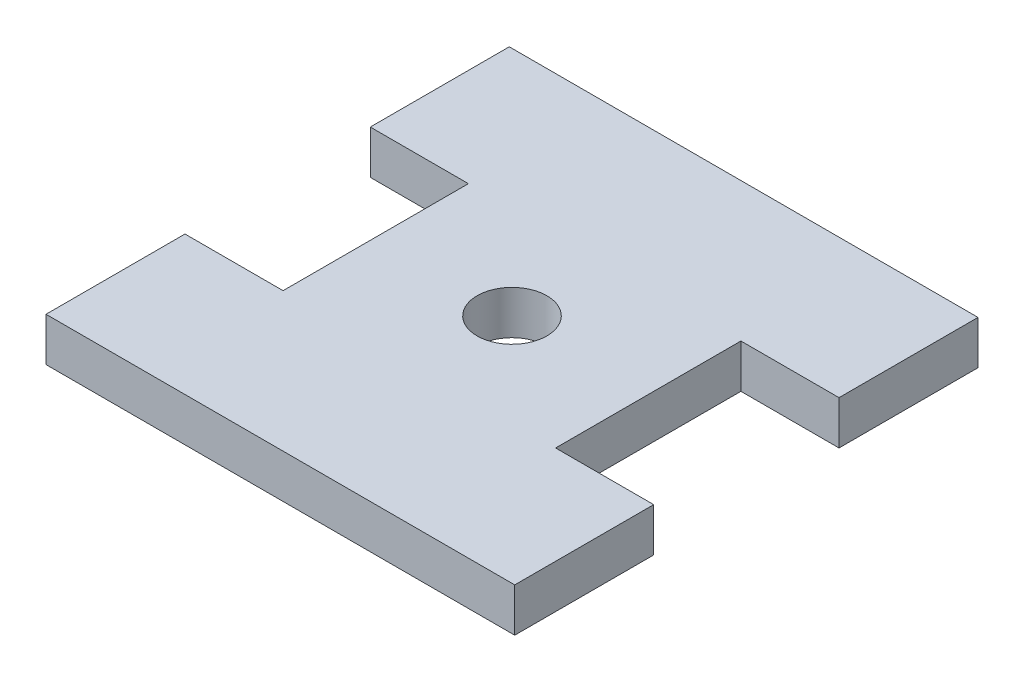
ISO-10303-21;
HEADER;
FILE_DESCRIPTION(('STEP AP214'),'2;1');
FILE_NAME('part.step','',(''),(''),'','','');
FILE_SCHEMA(('AUTOMOTIVE_DESIGN { 1 0 10303 214 1 1 1 1 }'));
ENDSEC;
DATA;
#1=APPLICATION_CONTEXT('core data for automotive mechanical design processes');
#2=APPLICATION_PROTOCOL_DEFINITION('international standard','automotive_design',2000,#1);
#3=PRODUCT_CONTEXT('',#1,'mechanical');
#4=PRODUCT('Part','Part','',(#3));
#5=PRODUCT_RELATED_PRODUCT_CATEGORY('part','',(#4));
#6=PRODUCT_DEFINITION_FORMATION('','',#4);
#7=PRODUCT_DEFINITION_CONTEXT('part definition',#1,'design');
#8=PRODUCT_DEFINITION('design','',#6,#7);
#9=PRODUCT_DEFINITION_SHAPE('','',#8);
#10=(LENGTH_UNIT() NAMED_UNIT(*) SI_UNIT(.MILLI.,.METRE.));
#11=(NAMED_UNIT(*) PLANE_ANGLE_UNIT() SI_UNIT($,.RADIAN.));
#12=(NAMED_UNIT(*) SI_UNIT($,.STERADIAN.) SOLID_ANGLE_UNIT());
#13=UNCERTAINTY_MEASURE_WITH_UNIT(LENGTH_MEASURE(1.E-05),#10,'distance_accuracy_value','');
#14=(GEOMETRIC_REPRESENTATION_CONTEXT(3) GLOBAL_UNCERTAINTY_ASSIGNED_CONTEXT((#13)) GLOBAL_UNIT_ASSIGNED_CONTEXT((#10,
#11,#12)) REPRESENTATION_CONTEXT('',''));
#15=CARTESIAN_POINT('',(0.,0.,0.));
#16=DIRECTION('',(0.,0.,1.));
#17=DIRECTION('',(1.,0.,0.));
#18=AXIS2_PLACEMENT_3D('',#15,#16,#17);
#19=CARTESIAN_POINT('',(58.3260528824176,4.,20.6399232100999));
#20=DIRECTION('',(-1.,0.,0.));
#21=DIRECTION('',(0.,0.,1.));
#22=AXIS2_PLACEMENT_3D('',#19,#20,#21);
#23=PLANE('',#22);
#24=DIRECTION('',(0.,0.,-1.));
#25=VECTOR('',#24,1.);
#26=CARTESIAN_POINT('',(58.3260528824176,0.,20.6399232100999));
#27=LINE('',#26,#25);
#28=CARTESIAN_POINT('',(58.3260528824176,0.,63.1399232100999));
#29=VERTEX_POINT('',#28);
#30=CARTESIAN_POINT('',(58.3260528824176,0.,50.3899232100999));
#31=VERTEX_POINT('',#30);
#32=EDGE_CURVE('E205',#29,#31,#27,.T.);
#33=ORIENTED_EDGE('',*,*,#32,.T.);
#34=DIRECTION('',(0.,1.,0.));
#35=VECTOR('',#34,1.);
#36=CARTESIAN_POINT('',(58.3260528824176,0.,50.3899232100999));
#37=LINE('',#36,#35);
#38=CARTESIAN_POINT('',(58.3260528824176,4.,50.3899232100999));
#39=VERTEX_POINT('',#38);
#40=EDGE_CURVE('E151',#31,#39,#37,.T.);
#41=ORIENTED_EDGE('',*,*,#40,.T.);
#42=DIRECTION('',(0.,0.,-1.));
#43=VECTOR('',#42,1.);
#44=CARTESIAN_POINT('',(58.3260528824176,4.,20.6399232100999));
#45=LINE('',#44,#43);
#46=CARTESIAN_POINT('',(58.3260528824176,4.,63.1399232100999));
#47=VERTEX_POINT('',#46);
#48=EDGE_CURVE('E194',#47,#39,#45,.T.);
#49=ORIENTED_EDGE('',*,*,#48,.F.);
#50=DIRECTION('',(0.,-1.,0.));
#51=VECTOR('',#50,1.);
#52=CARTESIAN_POINT('',(58.3260528824176,4.,63.1399232100999));
#53=LINE('',#52,#51);
#54=EDGE_CURVE('E40',#47,#29,#53,.T.);
#55=ORIENTED_EDGE('',*,*,#54,.T.);
#56=EDGE_LOOP('',(#33,#41,#49,#55));
#57=FACE_BOUND('',#56,.T.);
#58=ADVANCED_FACE('F32',(#57),#23,.F.);
#59=CARTESIAN_POINT('',(15.3260528824176,4.,20.6399232100999));
#60=DIRECTION('',(1.,0.,0.));
#61=DIRECTION('',(0.,0.,-1.));
#62=AXIS2_PLACEMENT_3D('',#59,#60,#61);
#63=PLANE('',#62);
#64=DIRECTION('',(0.,0.,1.));
#65=VECTOR('',#64,1.);
#66=CARTESIAN_POINT('',(15.3260528824176,0.,20.6399232100999));
#67=LINE('',#66,#65);
#68=CARTESIAN_POINT('',(15.3260528824176,0.,20.6399232100999));
#69=VERTEX_POINT('',#68);
#70=CARTESIAN_POINT('',(15.3260528824176,0.,33.3899232100999));
#71=VERTEX_POINT('',#70);
#72=EDGE_CURVE('E200',#69,#71,#67,.T.);
#73=ORIENTED_EDGE('',*,*,#72,.T.);
#74=DIRECTION('',(0.,1.,0.));
#75=VECTOR('',#74,1.);
#76=CARTESIAN_POINT('',(15.3260528824176,0.,33.3899232100999));
#77=LINE('',#76,#75);
#78=CARTESIAN_POINT('',(15.3260528824176,4.,33.3899232100999));
#79=VERTEX_POINT('',#78);
#80=EDGE_CURVE('E172',#71,#79,#77,.T.);
#81=ORIENTED_EDGE('',*,*,#80,.T.);
#82=DIRECTION('',(0.,0.,1.));
#83=VECTOR('',#82,1.);
#84=CARTESIAN_POINT('',(15.3260528824176,4.,20.6399232100999));
#85=LINE('',#84,#83);
#86=CARTESIAN_POINT('',(15.3260528824176,4.,20.6399232100999));
#87=VERTEX_POINT('',#86);
#88=EDGE_CURVE('E187',#87,#79,#85,.T.);
#89=ORIENTED_EDGE('',*,*,#88,.F.);
#90=DIRECTION('',(0.,-1.,0.));
#91=VECTOR('',#90,1.);
#92=CARTESIAN_POINT('',(15.3260528824176,4.,20.6399232100999));
#93=LINE('',#92,#91);
#94=EDGE_CURVE('E199',#87,#69,#93,.T.);
#95=ORIENTED_EDGE('',*,*,#94,.T.);
#96=EDGE_LOOP('',(#73,#81,#89,#95));
#97=FACE_BOUND('',#96,.T.);
#98=ADVANCED_FACE('F245',(#97),#63,.F.);
#99=CARTESIAN_POINT('',(15.3260528824176,4.,63.1399232100999));
#100=DIRECTION('',(0.,1.,0.));
#101=DIRECTION('',(0.,0.,1.));
#102=AXIS2_PLACEMENT_3D('',#99,#100,#101);
#103=PLANE('',#102);
#104=DIRECTION('',(1.,0.,0.));
#105=VECTOR('',#104,1.);
#106=CARTESIAN_POINT('',(58.3260528824176,4.,50.3899232100999));
#107=LINE('',#106,#105);
#108=CARTESIAN_POINT('',(49.3260528824176,4.,50.3899232100999));
#109=VERTEX_POINT('',#108);
#110=EDGE_CURVE('E143',#109,#39,#107,.T.);
#111=ORIENTED_EDGE('',*,*,#110,.F.);
#112=DIRECTION('',(0.,0.,1.));
#113=VECTOR('',#112,1.);
#114=CARTESIAN_POINT('',(49.3260528824176,4.,33.3899232100999));
#115=LINE('',#114,#113);
#116=CARTESIAN_POINT('',(49.3260528824176,4.,33.3899232100999));
#117=VERTEX_POINT('',#116);
#118=EDGE_CURVE('E145',#117,#109,#115,.T.);
#119=ORIENTED_EDGE('',*,*,#118,.F.);
#120=DIRECTION('',(-1.,0.,0.));
#121=VECTOR('',#120,1.);
#122=CARTESIAN_POINT('',(58.3260528824176,4.,33.3899232100999));
#123=LINE('',#122,#121);
#124=CARTESIAN_POINT('',(58.3260528824176,4.,33.3899232100999));
#125=VERTEX_POINT('',#124);
#126=EDGE_CURVE('E123',#125,#117,#123,.T.);
#127=ORIENTED_EDGE('',*,*,#126,.F.);
#128=CARTESIAN_POINT('',(58.3260528824176,4.,20.6399232100999));
#129=VERTEX_POINT('',#128);
#130=EDGE_CURVE('E193',#125,#129,#45,.T.);
#131=ORIENTED_EDGE('',*,*,#130,.T.);
#132=DIRECTION('',(-1.,0.,0.));
#133=VECTOR('',#132,1.);
#134=CARTESIAN_POINT('',(15.3260528824176,4.,20.6399232100999));
#135=LINE('',#134,#133);
#136=EDGE_CURVE('E197',#129,#87,#135,.T.);
#137=ORIENTED_EDGE('',*,*,#136,.T.);
#138=ORIENTED_EDGE('',*,*,#88,.T.);
#139=DIRECTION('',(-1.,0.,0.));
#140=VECTOR('',#139,1.);
#141=CARTESIAN_POINT('',(15.3260528824176,4.,33.3899232100999));
#142=LINE('',#141,#140);
#143=CARTESIAN_POINT('',(24.3260528824176,4.,33.3899232100999));
#144=VERTEX_POINT('',#143);
#145=EDGE_CURVE('E159',#144,#79,#142,.T.);
#146=ORIENTED_EDGE('',*,*,#145,.F.);
#147=DIRECTION('',(0.,0.,-1.));
#148=VECTOR('',#147,1.);
#149=CARTESIAN_POINT('',(24.3260528824176,4.,33.3899232100999));
#150=LINE('',#149,#148);
#151=CARTESIAN_POINT('',(24.3260528824176,4.,50.3899232100999));
#152=VERTEX_POINT('',#151);
#153=EDGE_CURVE('E168',#152,#144,#150,.T.);
#154=ORIENTED_EDGE('',*,*,#153,.F.);
#155=DIRECTION('',(1.,0.,0.));
#156=VECTOR('',#155,1.);
#157=CARTESIAN_POINT('',(15.3260528824176,4.,50.3899232100999));
#158=LINE('',#157,#156);
#159=CARTESIAN_POINT('',(15.3260528824176,4.,50.3899232100999));
#160=VERTEX_POINT('',#159);
#161=EDGE_CURVE('E154',#160,#152,#158,.T.);
#162=ORIENTED_EDGE('',*,*,#161,.F.);
#163=CARTESIAN_POINT('',(15.3260528824176,4.,63.1399232100999));
#164=VERTEX_POINT('',#163);
#165=EDGE_CURVE('E191',#160,#164,#85,.T.);
#166=ORIENTED_EDGE('',*,*,#165,.T.);
#167=DIRECTION('',(1.,0.,0.));
#168=VECTOR('',#167,1.);
#169=CARTESIAN_POINT('',(15.3260528824176,4.,63.1399232100999));
#170=LINE('',#169,#168);
#171=EDGE_CURVE('E190',#164,#47,#170,.T.);
#172=ORIENTED_EDGE('',*,*,#171,.T.);
#173=ORIENTED_EDGE('',*,*,#48,.T.);
#174=EDGE_LOOP('',(#111,#119,#127,#131,#137,#138,#146,#154,#162,#166,#172,#173));
#175=FACE_BOUND('',#174,.T.);
#176=CARTESIAN_POINT('',(36.8260528824176,4.,41.8899232100999));
#177=DIRECTION('',(0.,1.,0.));
#178=DIRECTION('',(0.,0.,1.));
#179=AXIS2_PLACEMENT_3D('',#176,#177,#178);
#180=CIRCLE('',#179,3.2);
#181=CARTESIAN_POINT('',(36.8260528824176,4.,45.0899232100999));
#182=VERTEX_POINT('',#181);
#183=EDGE_CURVE('E181',#182,#182,#180,.T.);
#184=ORIENTED_EDGE('',*,*,#183,.F.);
#185=EDGE_LOOP('',(#184));
#186=FACE_BOUND('',#185,.T.);
#187=ADVANCED_FACE('F227',(#175,#186),#103,.T.);
#188=CARTESIAN_POINT('',(15.3260528824176,0.,63.1399232100999));
#189=DIRECTION('',(0.,1.,0.));
#190=DIRECTION('',(0.,0.,1.));
#191=AXIS2_PLACEMENT_3D('',#188,#189,#190);
#192=PLANE('',#191);
#193=DIRECTION('',(0.,0.,1.));
#194=VECTOR('',#193,1.);
#195=CARTESIAN_POINT('',(49.3260528824176,0.,33.3899232100999));
#196=LINE('',#195,#194);
#197=CARTESIAN_POINT('',(49.3260528824176,0.,33.3899232100999));
#198=VERTEX_POINT('',#197);
#199=CARTESIAN_POINT('',(49.3260528824176,0.,50.3899232100999));
#200=VERTEX_POINT('',#199);
#201=EDGE_CURVE('E131',#198,#200,#196,.T.);
#202=ORIENTED_EDGE('',*,*,#201,.T.);
#203=DIRECTION('',(1.,0.,0.));
#204=VECTOR('',#203,1.);
#205=CARTESIAN_POINT('',(58.3260528824176,0.,50.3899232100999));
#206=LINE('',#205,#204);
#207=EDGE_CURVE('E136',#200,#31,#206,.T.);
#208=ORIENTED_EDGE('',*,*,#207,.T.);
#209=ORIENTED_EDGE('',*,*,#32,.F.);
#210=DIRECTION('',(1.,0.,0.));
#211=VECTOR('',#210,1.);
#212=CARTESIAN_POINT('',(15.3260528824176,0.,63.1399232100999));
#213=LINE('',#212,#211);
#214=CARTESIAN_POINT('',(15.3260528824176,0.,63.1399232100999));
#215=VERTEX_POINT('',#214);
#216=EDGE_CURVE('E203',#215,#29,#213,.T.);
#217=ORIENTED_EDGE('',*,*,#216,.F.);
#218=CARTESIAN_POINT('',(15.3260528824176,0.,50.3899232100999));
#219=VERTEX_POINT('',#218);
#220=EDGE_CURVE('E184',#219,#215,#67,.T.);
#221=ORIENTED_EDGE('',*,*,#220,.F.);
#222=DIRECTION('',(1.,0.,0.));
#223=VECTOR('',#222,1.);
#224=CARTESIAN_POINT('',(15.3260528824176,0.,50.3899232100999));
#225=LINE('',#224,#223);
#226=CARTESIAN_POINT('',(24.3260528824176,0.,50.3899232100999));
#227=VERTEX_POINT('',#226);
#228=EDGE_CURVE('E55',#219,#227,#225,.T.);
#229=ORIENTED_EDGE('',*,*,#228,.T.);
#230=DIRECTION('',(0.,0.,-1.));
#231=VECTOR('',#230,1.);
#232=CARTESIAN_POINT('',(24.3260528824176,0.,33.3899232100999));
#233=LINE('',#232,#231);
#234=CARTESIAN_POINT('',(24.3260528824176,0.,33.3899232100999));
#235=VERTEX_POINT('',#234);
#236=EDGE_CURVE('E158',#227,#235,#233,.T.);
#237=ORIENTED_EDGE('',*,*,#236,.T.);
#238=DIRECTION('',(-1.,0.,0.));
#239=VECTOR('',#238,1.);
#240=CARTESIAN_POINT('',(15.3260528824176,0.,33.3899232100999));
#241=LINE('',#240,#239);
#242=EDGE_CURVE('E162',#235,#71,#241,.T.);
#243=ORIENTED_EDGE('',*,*,#242,.T.);
#244=ORIENTED_EDGE('',*,*,#72,.F.);
#245=DIRECTION('',(-1.,0.,0.));
#246=VECTOR('',#245,1.);
#247=CARTESIAN_POINT('',(15.3260528824176,0.,20.6399232100999));
#248=LINE('',#247,#246);
#249=CARTESIAN_POINT('',(58.3260528824176,0.,20.6399232100999));
#250=VERTEX_POINT('',#249);
#251=EDGE_CURVE('E208',#250,#69,#248,.T.);
#252=ORIENTED_EDGE('',*,*,#251,.F.);
#253=CARTESIAN_POINT('',(58.3260528824176,0.,33.3899232100999));
#254=VERTEX_POINT('',#253);
#255=EDGE_CURVE('E142',#254,#250,#27,.T.);
#256=ORIENTED_EDGE('',*,*,#255,.F.);
#257=DIRECTION('',(-1.,0.,0.));
#258=VECTOR('',#257,1.);
#259=CARTESIAN_POINT('',(58.3260528824176,0.,33.3899232100999));
#260=LINE('',#259,#258);
#261=EDGE_CURVE('E47',#254,#198,#260,.T.);
#262=ORIENTED_EDGE('',*,*,#261,.T.);
#263=EDGE_LOOP('',(#202,#208,#209,#217,#221,#229,#237,#243,#244,#252,#256,#262));
#264=FACE_BOUND('',#263,.T.);
#265=CARTESIAN_POINT('',(36.8260528824176,0.,41.8899232100999));
#266=DIRECTION('',(0.,1.,0.));
#267=DIRECTION('',(0.,0.,1.));
#268=AXIS2_PLACEMENT_3D('',#265,#266,#267);
#269=CIRCLE('',#268,3.2);
#270=CARTESIAN_POINT('',(36.8260528824176,0.,45.0899232100999));
#271=VERTEX_POINT('',#270);
#272=EDGE_CURVE('E175',#271,#271,#269,.T.);
#273=ORIENTED_EDGE('',*,*,#272,.T.);
#274=EDGE_LOOP('',(#273));
#275=FACE_BOUND('',#274,.T.);
#276=ADVANCED_FACE('F139',(#264,#275),#192,.F.);
#277=ORIENTED_EDGE('',*,*,#165,.F.);
#278=DIRECTION('',(0.,1.,0.));
#279=VECTOR('',#278,1.);
#280=CARTESIAN_POINT('',(15.3260528824176,0.,50.3899232100999));
#281=LINE('',#280,#279);
#282=EDGE_CURVE('E165',#219,#160,#281,.T.);
#283=ORIENTED_EDGE('',*,*,#282,.F.);
#284=ORIENTED_EDGE('',*,*,#220,.T.);
#285=DIRECTION('',(0.,-1.,0.));
#286=VECTOR('',#285,1.);
#287=CARTESIAN_POINT('',(15.3260528824176,4.,63.1399232100999));
#288=LINE('',#287,#286);
#289=EDGE_CURVE('E11',#164,#215,#288,.T.);
#290=ORIENTED_EDGE('',*,*,#289,.F.);
#291=EDGE_LOOP('',(#277,#283,#284,#290));
#292=FACE_BOUND('',#291,.T.);
#293=ADVANCED_FACE('F34',(#292),#63,.F.);
#294=CARTESIAN_POINT('',(15.3260528824176,4.,63.1399232100999));
#295=DIRECTION('',(0.,0.,-1.));
#296=DIRECTION('',(-1.,0.,0.));
#297=AXIS2_PLACEMENT_3D('',#294,#295,#296);
#298=PLANE('',#297);
#299=ORIENTED_EDGE('',*,*,#216,.T.);
#300=ORIENTED_EDGE('',*,*,#54,.F.);
#301=ORIENTED_EDGE('',*,*,#171,.F.);
#302=ORIENTED_EDGE('',*,*,#289,.T.);
#303=EDGE_LOOP('',(#299,#300,#301,#302));
#304=FACE_BOUND('',#303,.T.);
#305=ADVANCED_FACE('F232',(#304),#298,.F.);
#306=ORIENTED_EDGE('',*,*,#130,.F.);
#307=DIRECTION('',(0.,1.,0.));
#308=VECTOR('',#307,1.);
#309=CARTESIAN_POINT('',(58.3260528824176,0.,33.3899232100999));
#310=LINE('',#309,#308);
#311=EDGE_CURVE('E128',#254,#125,#310,.T.);
#312=ORIENTED_EDGE('',*,*,#311,.F.);
#313=ORIENTED_EDGE('',*,*,#255,.T.);
#314=DIRECTION('',(0.,-1.,0.));
#315=VECTOR('',#314,1.);
#316=CARTESIAN_POINT('',(58.3260528824176,4.,20.6399232100999));
#317=LINE('',#316,#315);
#318=EDGE_CURVE('E212',#129,#250,#317,.T.);
#319=ORIENTED_EDGE('',*,*,#318,.F.);
#320=EDGE_LOOP('',(#306,#312,#313,#319));
#321=FACE_BOUND('',#320,.T.);
#322=ADVANCED_FACE('F253',(#321),#23,.F.);
#323=CARTESIAN_POINT('',(15.3260528824176,4.,20.6399232100999));
#324=DIRECTION('',(0.,0.,1.));
#325=DIRECTION('',(1.,0.,0.));
#326=AXIS2_PLACEMENT_3D('',#323,#324,#325);
#327=PLANE('',#326);
#328=ORIENTED_EDGE('',*,*,#251,.T.);
#329=ORIENTED_EDGE('',*,*,#94,.F.);
#330=ORIENTED_EDGE('',*,*,#136,.F.);
#331=ORIENTED_EDGE('',*,*,#318,.T.);
#332=EDGE_LOOP('',(#328,#329,#330,#331));
#333=FACE_BOUND('',#332,.T.);
#334=ADVANCED_FACE('F251',(#333),#327,.F.);
#335=CARTESIAN_POINT('',(36.8260528824176,4.,41.8899232100999));
#336=DIRECTION('',(0.,-1.,0.));
#337=DIRECTION('',(0.,0.,-1.));
#338=AXIS2_PLACEMENT_3D('',#335,#336,#337);
#339=CYLINDRICAL_SURFACE('',#338,3.2);
#340=ORIENTED_EDGE('',*,*,#183,.T.);
#341=EDGE_LOOP('',(#340));
#342=FACE_BOUND('',#341,.T.);
#343=ORIENTED_EDGE('',*,*,#272,.F.);
#344=EDGE_LOOP('',(#343));
#345=FACE_BOUND('',#344,.T.);
#346=ADVANCED_FACE('F260',(#342,#345),#339,.F.);
#347=CARTESIAN_POINT('',(15.3260528824176,0.,33.3899232100999));
#348=DIRECTION('',(0.,0.,-1.));
#349=DIRECTION('',(-1.,0.,0.));
#350=AXIS2_PLACEMENT_3D('',#347,#348,#349);
#351=PLANE('',#350);
#352=ORIENTED_EDGE('',*,*,#145,.T.);
#353=ORIENTED_EDGE('',*,*,#80,.F.);
#354=ORIENTED_EDGE('',*,*,#242,.F.);
#355=DIRECTION('',(0.,1.,0.));
#356=VECTOR('',#355,1.);
#357=CARTESIAN_POINT('',(24.3260528824176,0.,33.3899232100999));
#358=LINE('',#357,#356);
#359=EDGE_CURVE('E176',#235,#144,#358,.T.);
#360=ORIENTED_EDGE('',*,*,#359,.T.);
#361=EDGE_LOOP('',(#352,#353,#354,#360));
#362=FACE_BOUND('',#361,.T.);
#363=ADVANCED_FACE('F242',(#362),#351,.F.);
#364=CARTESIAN_POINT('',(24.3260528824176,0.,33.3899232100999));
#365=DIRECTION('',(1.,0.,0.));
#366=DIRECTION('',(0.,0.,-1.));
#367=AXIS2_PLACEMENT_3D('',#364,#365,#366);
#368=PLANE('',#367);
#369=ORIENTED_EDGE('',*,*,#153,.T.);
#370=ORIENTED_EDGE('',*,*,#359,.F.);
#371=ORIENTED_EDGE('',*,*,#236,.F.);
#372=DIRECTION('',(0.,1.,0.));
#373=VECTOR('',#372,1.);
#374=CARTESIAN_POINT('',(24.3260528824176,0.,50.3899232100999));
#375=LINE('',#374,#373);
#376=EDGE_CURVE('E178',#227,#152,#375,.T.);
#377=ORIENTED_EDGE('',*,*,#376,.T.);
#378=EDGE_LOOP('',(#369,#370,#371,#377));
#379=FACE_BOUND('',#378,.T.);
#380=ADVANCED_FACE('F238',(#379),#368,.F.);
#381=CARTESIAN_POINT('',(15.3260528824176,0.,50.3899232100999));
#382=DIRECTION('',(0.,0.,1.));
#383=DIRECTION('',(1.,0.,0.));
#384=AXIS2_PLACEMENT_3D('',#381,#382,#383);
#385=PLANE('',#384);
#386=ORIENTED_EDGE('',*,*,#161,.T.);
#387=ORIENTED_EDGE('',*,*,#376,.F.);
#388=ORIENTED_EDGE('',*,*,#228,.F.);
#389=ORIENTED_EDGE('',*,*,#282,.T.);
#390=EDGE_LOOP('',(#386,#387,#388,#389));
#391=FACE_BOUND('',#390,.T.);
#392=ADVANCED_FACE('F281',(#391),#385,.F.);
#393=CARTESIAN_POINT('',(58.3260528824176,0.,50.3899232100999));
#394=DIRECTION('',(0.,0.,1.));
#395=DIRECTION('',(1.,0.,0.));
#396=AXIS2_PLACEMENT_3D('',#393,#394,#395);
#397=PLANE('',#396);
#398=ORIENTED_EDGE('',*,*,#110,.T.);
#399=ORIENTED_EDGE('',*,*,#40,.F.);
#400=ORIENTED_EDGE('',*,*,#207,.F.);
#401=DIRECTION('',(0.,1.,0.));
#402=VECTOR('',#401,1.);
#403=CARTESIAN_POINT('',(49.3260528824176,0.,50.3899232100999));
#404=LINE('',#403,#402);
#405=EDGE_CURVE('E127',#200,#109,#404,.T.);
#406=ORIENTED_EDGE('',*,*,#405,.T.);
#407=EDGE_LOOP('',(#398,#399,#400,#406));
#408=FACE_BOUND('',#407,.T.);
#409=ADVANCED_FACE('F224',(#408),#397,.F.);
#410=CARTESIAN_POINT('',(49.3260528824176,0.,33.3899232100999));
#411=DIRECTION('',(-1.,0.,0.));
#412=DIRECTION('',(0.,0.,1.));
#413=AXIS2_PLACEMENT_3D('',#410,#411,#412);
#414=PLANE('',#413);
#415=ORIENTED_EDGE('',*,*,#118,.T.);
#416=ORIENTED_EDGE('',*,*,#405,.F.);
#417=ORIENTED_EDGE('',*,*,#201,.F.);
#418=DIRECTION('',(0.,1.,0.));
#419=VECTOR('',#418,1.);
#420=CARTESIAN_POINT('',(49.3260528824176,0.,33.3899232100999));
#421=LINE('',#420,#419);
#422=EDGE_CURVE('E119',#198,#117,#421,.T.);
#423=ORIENTED_EDGE('',*,*,#422,.T.);
#424=EDGE_LOOP('',(#415,#416,#417,#423));
#425=FACE_BOUND('',#424,.T.);
#426=ADVANCED_FACE('F132',(#425),#414,.F.);
#427=CARTESIAN_POINT('',(58.3260528824176,0.,33.3899232100999));
#428=DIRECTION('',(0.,0.,-1.));
#429=DIRECTION('',(-1.,0.,0.));
#430=AXIS2_PLACEMENT_3D('',#427,#428,#429);
#431=PLANE('',#430);
#432=ORIENTED_EDGE('',*,*,#126,.T.);
#433=ORIENTED_EDGE('',*,*,#422,.F.);
#434=ORIENTED_EDGE('',*,*,#261,.F.);
#435=ORIENTED_EDGE('',*,*,#311,.T.);
#436=EDGE_LOOP('',(#432,#433,#434,#435));
#437=FACE_BOUND('',#436,.T.);
#438=ADVANCED_FACE('F121',(#437),#431,.F.);
#439=CLOSED_SHELL('',(#58,#98,#187,#276,#293,#305,#322,#334,#346,#363,#380,#392,#409,#426,#438));
#440=MANIFOLD_SOLID_BREP('B2',#439);
#441=ADVANCED_BREP_SHAPE_REPRESENTATION('',(#18,#440),#14);
#442=SHAPE_DEFINITION_REPRESENTATION(#9,#441);
ENDSEC;
END-ISO-10303-21;
